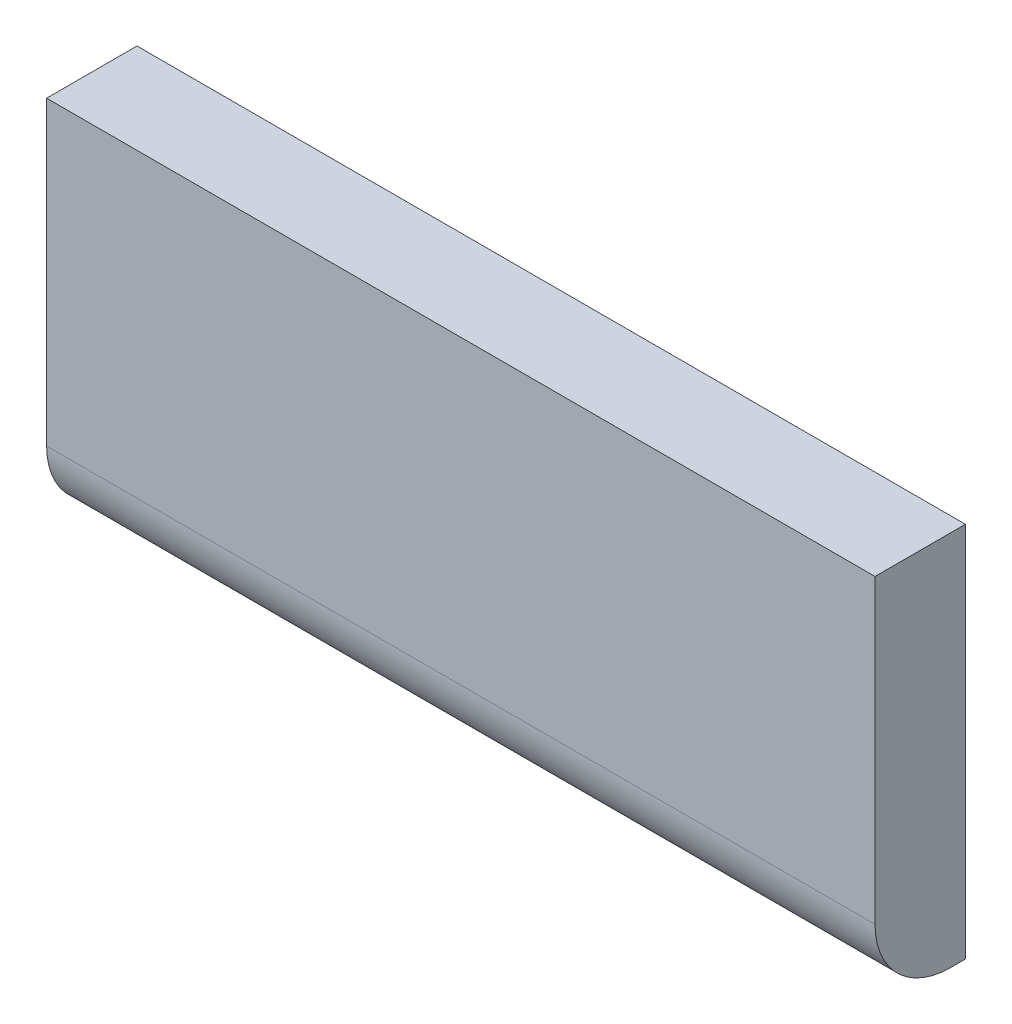
ISO-10303-21;
HEADER;
FILE_DESCRIPTION(('STEP AP214'),'2;1');
FILE_NAME('part.step','',(''),(''),'','','');
FILE_SCHEMA(('AUTOMOTIVE_DESIGN { 1 0 10303 214 1 1 1 1 }'));
ENDSEC;
DATA;
#1=APPLICATION_CONTEXT('core data for automotive mechanical design processes');
#2=APPLICATION_PROTOCOL_DEFINITION('international standard','automotive_design',2000,#1);
#3=PRODUCT_CONTEXT('',#1,'mechanical');
#4=PRODUCT('Part','Part','',(#3));
#5=PRODUCT_RELATED_PRODUCT_CATEGORY('part','',(#4));
#6=PRODUCT_DEFINITION_FORMATION('','',#4);
#7=PRODUCT_DEFINITION_CONTEXT('part definition',#1,'design');
#8=PRODUCT_DEFINITION('design','',#6,#7);
#9=PRODUCT_DEFINITION_SHAPE('','',#8);
#10=(LENGTH_UNIT() NAMED_UNIT(*) SI_UNIT(.MILLI.,.METRE.));
#11=(NAMED_UNIT(*) PLANE_ANGLE_UNIT() SI_UNIT($,.RADIAN.));
#12=(NAMED_UNIT(*) SI_UNIT($,.STERADIAN.) SOLID_ANGLE_UNIT());
#13=UNCERTAINTY_MEASURE_WITH_UNIT(LENGTH_MEASURE(1.E-05),#10,'distance_accuracy_value','');
#14=(GEOMETRIC_REPRESENTATION_CONTEXT(3) GLOBAL_UNCERTAINTY_ASSIGNED_CONTEXT((#13)) GLOBAL_UNIT_ASSIGNED_CONTEXT((#10,
#11,#12)) REPRESENTATION_CONTEXT('',''));
#15=CARTESIAN_POINT('',(0.,0.,0.));
#16=DIRECTION('',(0.,0.,1.));
#17=DIRECTION('',(1.,0.,0.));
#18=AXIS2_PLACEMENT_3D('',#15,#16,#17);
#19=CARTESIAN_POINT('',(27.5,12.5,6.));
#20=DIRECTION('',(-1.,0.,0.));
#21=DIRECTION('',(0.,-1.,0.));
#22=AXIS2_PLACEMENT_3D('',#19,#20,#21);
#23=PLANE('',#22);
#24=DIRECTION('',(0.,1.,0.));
#25=VECTOR('',#24,1.);
#26=CARTESIAN_POINT('',(27.5,12.5,6.));
#27=LINE('',#26,#25);
#28=CARTESIAN_POINT('',(27.5,-7.5,6.));
#29=VERTEX_POINT('',#28);
#30=CARTESIAN_POINT('',(27.5,12.5,6.));
#31=VERTEX_POINT('',#30);
#32=EDGE_CURVE('E81',#29,#31,#27,.T.);
#33=ORIENTED_EDGE('',*,*,#32,.F.);
#34=CARTESIAN_POINT('',(27.5,-7.5,1.));
#35=DIRECTION('',(-1.,0.,0.));
#36=DIRECTION('',(0.,-1.,0.));
#37=AXIS2_PLACEMENT_3D('',#34,#35,#36);
#38=CIRCLE('',#37,5.);
#39=CARTESIAN_POINT('',(27.5,-12.5,1.));
#40=VERTEX_POINT('',#39);
#41=EDGE_CURVE('E59',#29,#40,#38,.F.);
#42=ORIENTED_EDGE('',*,*,#41,.T.);
#43=DIRECTION('',(0.,0.,-1.));
#44=VECTOR('',#43,1.);
#45=CARTESIAN_POINT('',(27.5,-12.5,6.));
#46=LINE('',#45,#44);
#47=CARTESIAN_POINT('',(27.5,-12.5,0.));
#48=VERTEX_POINT('',#47);
#49=EDGE_CURVE('E111',#40,#48,#46,.T.);
#50=ORIENTED_EDGE('',*,*,#49,.T.);
#51=DIRECTION('',(0.,1.,0.));
#52=VECTOR('',#51,1.);
#53=CARTESIAN_POINT('',(27.5,12.5,0.));
#54=LINE('',#53,#52);
#55=CARTESIAN_POINT('',(27.5,12.5,0.));
#56=VERTEX_POINT('',#55);
#57=EDGE_CURVE('E103',#48,#56,#54,.T.);
#58=ORIENTED_EDGE('',*,*,#57,.T.);
#59=DIRECTION('',(0.,0.,-1.));
#60=VECTOR('',#59,1.);
#61=CARTESIAN_POINT('',(27.5,12.5,6.));
#62=LINE('',#61,#60);
#63=EDGE_CURVE('E95',#31,#56,#62,.T.);
#64=ORIENTED_EDGE('',*,*,#63,.F.);
#65=EDGE_LOOP('',(#33,#42,#50,#58,#64));
#66=FACE_BOUND('',#65,.T.);
#67=ADVANCED_FACE('F37',(#66),#23,.F.);
#68=CARTESIAN_POINT('',(-27.5,12.5,6.));
#69=DIRECTION('',(0.,-1.,0.));
#70=DIRECTION('',(0.,0.,-1.));
#71=AXIS2_PLACEMENT_3D('',#68,#69,#70);
#72=PLANE('',#71);
#73=DIRECTION('',(-1.,0.,0.));
#74=VECTOR('',#73,1.);
#75=CARTESIAN_POINT('',(-27.5,12.5,0.));
#76=LINE('',#75,#74);
#77=CARTESIAN_POINT('',(-27.5,12.5,0.));
#78=VERTEX_POINT('',#77);
#79=EDGE_CURVE('E118',#56,#78,#76,.T.);
#80=ORIENTED_EDGE('',*,*,#79,.T.);
#81=DIRECTION('',(0.,0.,-1.));
#82=VECTOR('',#81,1.);
#83=CARTESIAN_POINT('',(-27.5,12.5,6.));
#84=LINE('',#83,#82);
#85=CARTESIAN_POINT('',(-27.5,12.5,6.));
#86=VERTEX_POINT('',#85);
#87=EDGE_CURVE('E98',#86,#78,#84,.T.);
#88=ORIENTED_EDGE('',*,*,#87,.F.);
#89=DIRECTION('',(-1.,0.,0.));
#90=VECTOR('',#89,1.);
#91=CARTESIAN_POINT('',(-27.5,12.5,6.));
#92=LINE('',#91,#90);
#93=EDGE_CURVE('E85',#31,#86,#92,.T.);
#94=ORIENTED_EDGE('',*,*,#93,.F.);
#95=ORIENTED_EDGE('',*,*,#63,.T.);
#96=EDGE_LOOP('',(#80,#88,#94,#95));
#97=FACE_BOUND('',#96,.T.);
#98=ADVANCED_FACE('F94',(#97),#72,.F.);
#99=CARTESIAN_POINT('',(-27.5,12.5,6.));
#100=DIRECTION('',(1.,0.,0.));
#101=DIRECTION('',(0.,0.,-1.));
#102=AXIS2_PLACEMENT_3D('',#99,#100,#101);
#103=PLANE('',#102);
#104=DIRECTION('',(0.,0.,-1.));
#105=VECTOR('',#104,1.);
#106=CARTESIAN_POINT('',(-27.5,-12.5,6.));
#107=LINE('',#106,#105);
#108=CARTESIAN_POINT('',(-27.5,-12.5,1.));
#109=VERTEX_POINT('',#108);
#110=CARTESIAN_POINT('',(-27.5,-12.5,0.));
#111=VERTEX_POINT('',#110);
#112=EDGE_CURVE('E106',#109,#111,#107,.T.);
#113=ORIENTED_EDGE('',*,*,#112,.F.);
#114=CARTESIAN_POINT('',(-27.5,-7.5,1.));
#115=DIRECTION('',(1.,0.,0.));
#116=DIRECTION('',(0.,0.,-1.));
#117=AXIS2_PLACEMENT_3D('',#114,#115,#116);
#118=CIRCLE('',#117,5.);
#119=CARTESIAN_POINT('',(-27.5,-7.5,6.));
#120=VERTEX_POINT('',#119);
#121=EDGE_CURVE('E11',#109,#120,#118,.F.);
#122=ORIENTED_EDGE('',*,*,#121,.T.);
#123=DIRECTION('',(0.,-1.,0.));
#124=VECTOR('',#123,1.);
#125=CARTESIAN_POINT('',(-27.5,12.5,6.));
#126=LINE('',#125,#124);
#127=EDGE_CURVE('E100',#86,#120,#126,.T.);
#128=ORIENTED_EDGE('',*,*,#127,.F.);
#129=ORIENTED_EDGE('',*,*,#87,.T.);
#130=DIRECTION('',(0.,-1.,0.));
#131=VECTOR('',#130,1.);
#132=CARTESIAN_POINT('',(-27.5,12.5,0.));
#133=LINE('',#132,#131);
#134=EDGE_CURVE('E115',#78,#111,#133,.T.);
#135=ORIENTED_EDGE('',*,*,#134,.T.);
#136=EDGE_LOOP('',(#113,#122,#128,#129,#135));
#137=FACE_BOUND('',#136,.T.);
#138=ADVANCED_FACE('F124',(#137),#103,.F.);
#139=CARTESIAN_POINT('',(-27.5,-12.5,6.));
#140=DIRECTION('',(0.,1.,0.));
#141=DIRECTION('',(0.,0.,1.));
#142=AXIS2_PLACEMENT_3D('',#139,#140,#141);
#143=PLANE('',#142);
#144=ORIENTED_EDGE('',*,*,#49,.F.);
#145=DIRECTION('',(1.,0.,0.));
#146=VECTOR('',#145,1.);
#147=CARTESIAN_POINT('',(-27.5,-12.5,1.));
#148=LINE('',#147,#146);
#149=EDGE_CURVE('E45',#40,#109,#148,.F.);
#150=ORIENTED_EDGE('',*,*,#149,.T.);
#151=ORIENTED_EDGE('',*,*,#112,.T.);
#152=DIRECTION('',(1.,0.,0.));
#153=VECTOR('',#152,1.);
#154=CARTESIAN_POINT('',(-27.5,-12.5,0.));
#155=LINE('',#154,#153);
#156=EDGE_CURVE('E90',#111,#48,#155,.T.);
#157=ORIENTED_EDGE('',*,*,#156,.T.);
#158=EDGE_LOOP('',(#144,#150,#151,#157));
#159=FACE_BOUND('',#158,.T.);
#160=ADVANCED_FACE('F127',(#159),#143,.F.);
#161=CARTESIAN_POINT('',(0.,0.,6.));
#162=DIRECTION('',(0.,0.,1.));
#163=DIRECTION('',(1.,0.,0.));
#164=AXIS2_PLACEMENT_3D('',#161,#162,#163);
#165=PLANE('',#164);
#166=ORIENTED_EDGE('',*,*,#127,.T.);
#167=DIRECTION('',(1.,0.,0.));
#168=VECTOR('',#167,1.);
#169=CARTESIAN_POINT('',(27.5,-7.5,6.));
#170=LINE('',#169,#168);
#171=EDGE_CURVE('E88',#120,#29,#170,.T.);
#172=ORIENTED_EDGE('',*,*,#171,.T.);
#173=ORIENTED_EDGE('',*,*,#32,.T.);
#174=ORIENTED_EDGE('',*,*,#93,.T.);
#175=EDGE_LOOP('',(#166,#172,#173,#174));
#176=FACE_BOUND('',#175,.T.);
#177=ADVANCED_FACE('F84',(#176),#165,.T.);
#178=CARTESIAN_POINT('',(0.,0.,0.));
#179=DIRECTION('',(0.,0.,1.));
#180=DIRECTION('',(1.,0.,0.));
#181=AXIS2_PLACEMENT_3D('',#178,#179,#180);
#182=PLANE('',#181);
#183=ORIENTED_EDGE('',*,*,#57,.F.);
#184=ORIENTED_EDGE('',*,*,#156,.F.);
#185=ORIENTED_EDGE('',*,*,#134,.F.);
#186=ORIENTED_EDGE('',*,*,#79,.F.);
#187=EDGE_LOOP('',(#183,#184,#185,#186));
#188=FACE_BOUND('',#187,.T.);
#189=ADVANCED_FACE('F129',(#188),#182,.F.);
#190=CARTESIAN_POINT('',(0.,-7.5,1.));
#191=DIRECTION('',(-1.,0.,0.));
#192=DIRECTION('',(0.,0.,1.));
#193=AXIS2_PLACEMENT_3D('',#190,#191,#192);
#194=CYLINDRICAL_SURFACE('',#193,5.);
#195=ORIENTED_EDGE('',*,*,#121,.F.);
#196=ORIENTED_EDGE('',*,*,#149,.F.);
#197=ORIENTED_EDGE('',*,*,#41,.F.);
#198=ORIENTED_EDGE('',*,*,#171,.F.);
#199=EDGE_LOOP('',(#195,#196,#197,#198));
#200=FACE_BOUND('',#199,.T.);
#201=ADVANCED_FACE('F39',(#200),#194,.T.);
#202=CLOSED_SHELL('',(#67,#98,#138,#160,#177,#189,#201));
#203=MANIFOLD_SOLID_BREP('B2',#202);
#204=ADVANCED_BREP_SHAPE_REPRESENTATION('',(#18,#203),#14);
#205=SHAPE_DEFINITION_REPRESENTATION(#9,#204);
ENDSEC;
END-ISO-10303-21;
